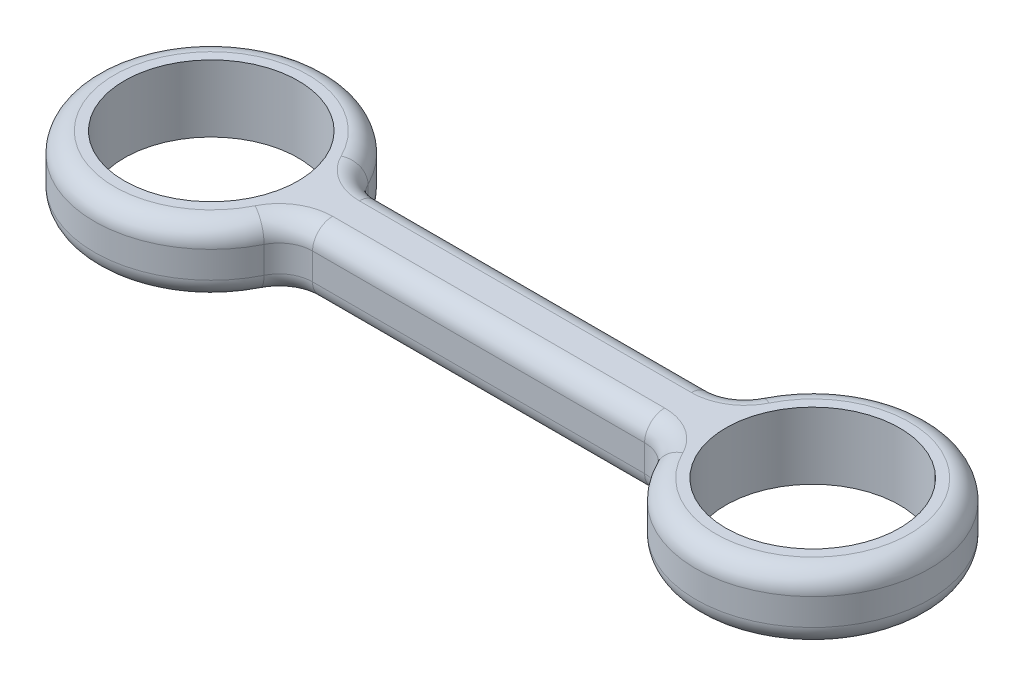
ISO-10303-21;
HEADER;
FILE_DESCRIPTION(('STEP AP214'),'2;1');
FILE_NAME('part.step','',(''),(''),'','','');
FILE_SCHEMA(('AUTOMOTIVE_DESIGN { 1 0 10303 214 1 1 1 1 }'));
ENDSEC;
DATA;
#1=APPLICATION_CONTEXT('core data for automotive mechanical design processes');
#2=APPLICATION_PROTOCOL_DEFINITION('international standard','automotive_design',2000,#1);
#3=PRODUCT_CONTEXT('',#1,'mechanical');
#4=PRODUCT('Part','Part','',(#3));
#5=PRODUCT_RELATED_PRODUCT_CATEGORY('part','',(#4));
#6=PRODUCT_DEFINITION_FORMATION('','',#4);
#7=PRODUCT_DEFINITION_CONTEXT('part definition',#1,'design');
#8=PRODUCT_DEFINITION('design','',#6,#7);
#9=PRODUCT_DEFINITION_SHAPE('','',#8);
#10=(LENGTH_UNIT() NAMED_UNIT(*) SI_UNIT(.MILLI.,.METRE.));
#11=(NAMED_UNIT(*) PLANE_ANGLE_UNIT() SI_UNIT($,.RADIAN.));
#12=(NAMED_UNIT(*) SI_UNIT($,.STERADIAN.) SOLID_ANGLE_UNIT());
#13=UNCERTAINTY_MEASURE_WITH_UNIT(LENGTH_MEASURE(1.E-05),#10,'distance_accuracy_value','');
#14=(GEOMETRIC_REPRESENTATION_CONTEXT(3) GLOBAL_UNCERTAINTY_ASSIGNED_CONTEXT((#13)) GLOBAL_UNIT_ASSIGNED_CONTEXT((#10,
#11,#12)) REPRESENTATION_CONTEXT('',''));
#15=CARTESIAN_POINT('',(0.,0.,0.));
#16=DIRECTION('',(0.,0.,1.));
#17=DIRECTION('',(1.,0.,0.));
#18=AXIS2_PLACEMENT_3D('',#15,#16,#17);
#19=CARTESIAN_POINT('',(0.,5.,0.));
#20=DIRECTION('',(0.,1.,0.));
#21=DIRECTION('',(0.,0.,1.));
#22=AXIS2_PLACEMENT_3D('',#19,#20,#21);
#23=PLANE('',#22);
#24=CARTESIAN_POINT('',(0.,5.,0.));
#25=DIRECTION('',(0.,1.,0.));
#26=DIRECTION('',(0.,0.,1.));
#27=AXIS2_PLACEMENT_3D('',#24,#25,#26);
#28=CIRCLE('',#27,14.5);
#29=CARTESIAN_POINT('',(12.9891930389254,5.,-6.44444444444444));
#30=VERTEX_POINT('',#29);
#31=CARTESIAN_POINT('',(12.9891930389254,5.,6.44444444444445));
#32=VERTEX_POINT('',#31);
#33=EDGE_CURVE('E63',#30,#32,#28,.T.);
#34=ORIENTED_EDGE('',*,*,#33,.T.);
#35=CARTESIAN_POINT('',(20.1556443707464,5.,10.));
#36=DIRECTION('',(0.,1.,0.));
#37=DIRECTION('',(0.,0.,1.));
#38=AXIS2_PLACEMENT_3D('',#35,#36,#37);
#39=CIRCLE('',#38,8.);
#40=CARTESIAN_POINT('',(20.1556443707464,5.,2.));
#41=VERTEX_POINT('',#40);
#42=EDGE_CURVE('E277',#32,#41,#39,.F.);
#43=ORIENTED_EDGE('',*,*,#42,.T.);
#44=DIRECTION('',(1.,0.,0.));
#45=VECTOR('',#44,1.);
#46=CARTESIAN_POINT('',(69.8443556292536,5.,2.));
#47=LINE('',#46,#45);
#48=CARTESIAN_POINT('',(69.8443556292536,5.,2.));
#49=VERTEX_POINT('',#48);
#50=EDGE_CURVE('E258',#41,#49,#47,.T.);
#51=ORIENTED_EDGE('',*,*,#50,.T.);
#52=CARTESIAN_POINT('',(69.8443556292536,5.,10.));
#53=DIRECTION('',(0.,1.,0.));
#54=DIRECTION('',(0.,0.,1.));
#55=AXIS2_PLACEMENT_3D('',#52,#53,#54);
#56=CIRCLE('',#55,8.);
#57=CARTESIAN_POINT('',(77.0108069610746,5.,6.44444444444444));
#58=VERTEX_POINT('',#57);
#59=EDGE_CURVE('E261',#49,#58,#56,.F.);
#60=ORIENTED_EDGE('',*,*,#59,.T.);
#61=CARTESIAN_POINT('',(90.,5.,0.));
#62=DIRECTION('',(0.,1.,0.));
#63=DIRECTION('',(0.,0.,1.));
#64=AXIS2_PLACEMENT_3D('',#61,#62,#63);
#65=CIRCLE('',#64,14.5);
#66=CARTESIAN_POINT('',(77.0108069610746,5.,-6.44444444444445));
#67=VERTEX_POINT('',#66);
#68=EDGE_CURVE('E264',#58,#67,#65,.T.);
#69=ORIENTED_EDGE('',*,*,#68,.T.);
#70=CARTESIAN_POINT('',(69.8443556292536,5.,-10.));
#71=DIRECTION('',(0.,1.,0.));
#72=DIRECTION('',(0.,0.,1.));
#73=AXIS2_PLACEMENT_3D('',#70,#71,#72);
#74=CIRCLE('',#73,8.);
#75=CARTESIAN_POINT('',(69.8443556292536,5.,-2.));
#76=VERTEX_POINT('',#75);
#77=EDGE_CURVE('E267',#67,#76,#74,.F.);
#78=ORIENTED_EDGE('',*,*,#77,.T.);
#79=DIRECTION('',(-1.,0.,0.));
#80=VECTOR('',#79,1.);
#81=CARTESIAN_POINT('',(20.1556443707464,5.,-2.));
#82=LINE('',#81,#80);
#83=CARTESIAN_POINT('',(20.1556443707464,5.,-2.));
#84=VERTEX_POINT('',#83);
#85=EDGE_CURVE('E270',#76,#84,#82,.T.);
#86=ORIENTED_EDGE('',*,*,#85,.T.);
#87=CARTESIAN_POINT('',(20.1556443707464,5.,-10.));
#88=DIRECTION('',(0.,1.,0.));
#89=DIRECTION('',(0.,0.,1.));
#90=AXIS2_PLACEMENT_3D('',#87,#88,#89);
#91=CIRCLE('',#90,8.);
#92=EDGE_CURVE('E68',#84,#30,#91,.F.);
#93=ORIENTED_EDGE('',*,*,#92,.T.);
#94=EDGE_LOOP('',(#34,#43,#51,#60,#69,#78,#86,#93));
#95=FACE_BOUND('',#94,.T.);
#96=CARTESIAN_POINT('',(0.,5.,0.));
#97=DIRECTION('',(0.,1.,0.));
#98=DIRECTION('',(0.,0.,1.));
#99=AXIS2_PLACEMENT_3D('',#96,#97,#98);
#100=CIRCLE('',#99,13.);
#101=CARTESIAN_POINT('',(0.,5.,13.));
#102=VERTEX_POINT('',#101);
#103=EDGE_CURVE('E362',#102,#102,#100,.T.);
#104=ORIENTED_EDGE('',*,*,#103,.F.);
#105=EDGE_LOOP('',(#104));
#106=FACE_BOUND('',#105,.T.);
#107=CARTESIAN_POINT('',(90.,5.,0.));
#108=DIRECTION('',(0.,1.,0.));
#109=DIRECTION('',(0.,0.,1.));
#110=AXIS2_PLACEMENT_3D('',#107,#108,#109);
#111=CIRCLE('',#110,13.);
#112=CARTESIAN_POINT('',(90.,5.,13.));
#113=VERTEX_POINT('',#112);
#114=EDGE_CURVE('E738',#113,#113,#111,.T.);
#115=ORIENTED_EDGE('',*,*,#114,.F.);
#116=EDGE_LOOP('',(#115));
#117=FACE_BOUND('',#116,.T.);
#118=ADVANCED_FACE('F45',(#95,#106,#117),#23,.T.);
#119=CARTESIAN_POINT('',(0.,-5.,0.));
#120=DIRECTION('',(0.,1.,0.));
#121=DIRECTION('',(0.,0.,1.));
#122=AXIS2_PLACEMENT_3D('',#119,#120,#121);
#123=PLANE('',#122);
#124=DIRECTION('',(1.,0.,0.));
#125=VECTOR('',#124,1.);
#126=CARTESIAN_POINT('',(0.,-5.,2.));
#127=LINE('',#126,#125);
#128=CARTESIAN_POINT('',(69.8443556292536,-5.,2.));
#129=VERTEX_POINT('',#128);
#130=CARTESIAN_POINT('',(20.1556443707464,-5.,2.));
#131=VERTEX_POINT('',#130);
#132=EDGE_CURVE('E165',#129,#131,#127,.F.);
#133=ORIENTED_EDGE('',*,*,#132,.T.);
#134=CARTESIAN_POINT('',(20.1556443707464,-5.,10.));
#135=DIRECTION('',(0.,1.,0.));
#136=DIRECTION('',(0.,0.,1.));
#137=AXIS2_PLACEMENT_3D('',#134,#135,#136);
#138=CIRCLE('',#137,8.);
#139=CARTESIAN_POINT('',(12.9891930389254,-5.,6.44444444444445));
#140=VERTEX_POINT('',#139);
#141=EDGE_CURVE('E212',#131,#140,#138,.T.);
#142=ORIENTED_EDGE('',*,*,#141,.T.);
#143=CARTESIAN_POINT('',(0.,-5.,0.));
#144=DIRECTION('',(0.,1.,0.));
#145=DIRECTION('',(0.,0.,1.));
#146=AXIS2_PLACEMENT_3D('',#143,#144,#145);
#147=CIRCLE('',#146,14.5);
#148=CARTESIAN_POINT('',(12.9891930389254,-5.,-6.44444444444444));
#149=VERTEX_POINT('',#148);
#150=EDGE_CURVE('E209',#140,#149,#147,.F.);
#151=ORIENTED_EDGE('',*,*,#150,.T.);
#152=CARTESIAN_POINT('',(20.1556443707464,-5.,-10.));
#153=DIRECTION('',(0.,1.,0.));
#154=DIRECTION('',(0.,0.,1.));
#155=AXIS2_PLACEMENT_3D('',#152,#153,#154);
#156=CIRCLE('',#155,8.);
#157=CARTESIAN_POINT('',(20.1556443707464,-5.,-2.));
#158=VERTEX_POINT('',#157);
#159=EDGE_CURVE('E206',#149,#158,#156,.T.);
#160=ORIENTED_EDGE('',*,*,#159,.T.);
#161=DIRECTION('',(-1.,0.,0.));
#162=VECTOR('',#161,1.);
#163=CARTESIAN_POINT('',(0.,-5.,-2.));
#164=LINE('',#163,#162);
#165=CARTESIAN_POINT('',(69.8443556292536,-5.,-2.));
#166=VERTEX_POINT('',#165);
#167=EDGE_CURVE('E203',#158,#166,#164,.F.);
#168=ORIENTED_EDGE('',*,*,#167,.T.);
#169=CARTESIAN_POINT('',(69.8443556292536,-5.,-10.));
#170=DIRECTION('',(0.,1.,0.));
#171=DIRECTION('',(0.,0.,1.));
#172=AXIS2_PLACEMENT_3D('',#169,#170,#171);
#173=CIRCLE('',#172,8.);
#174=CARTESIAN_POINT('',(77.0108069610746,-5.,-6.44444444444445));
#175=VERTEX_POINT('',#174);
#176=EDGE_CURVE('E200',#166,#175,#173,.T.);
#177=ORIENTED_EDGE('',*,*,#176,.T.);
#178=CARTESIAN_POINT('',(90.,-5.,0.));
#179=DIRECTION('',(0.,1.,0.));
#180=DIRECTION('',(0.,0.,1.));
#181=AXIS2_PLACEMENT_3D('',#178,#179,#180);
#182=CIRCLE('',#181,14.5);
#183=CARTESIAN_POINT('',(77.0108069610746,-5.,6.44444444444444));
#184=VERTEX_POINT('',#183);
#185=EDGE_CURVE('E168',#175,#184,#182,.F.);
#186=ORIENTED_EDGE('',*,*,#185,.T.);
#187=CARTESIAN_POINT('',(69.8443556292536,-5.,10.));
#188=DIRECTION('',(0.,1.,0.));
#189=DIRECTION('',(0.,0.,1.));
#190=AXIS2_PLACEMENT_3D('',#187,#188,#189);
#191=CIRCLE('',#190,8.);
#192=EDGE_CURVE('E159',#184,#129,#191,.T.);
#193=ORIENTED_EDGE('',*,*,#192,.T.);
#194=EDGE_LOOP('',(#133,#142,#151,#160,#168,#177,#186,#193));
#195=FACE_BOUND('',#194,.T.);
#196=CARTESIAN_POINT('',(0.,-5.,0.));
#197=DIRECTION('',(0.,1.,0.));
#198=DIRECTION('',(0.,0.,1.));
#199=AXIS2_PLACEMENT_3D('',#196,#197,#198);
#200=CIRCLE('',#199,13.);
#201=CARTESIAN_POINT('',(0.,-5.,13.));
#202=VERTEX_POINT('',#201);
#203=EDGE_CURVE('E370',#202,#202,#200,.T.);
#204=ORIENTED_EDGE('',*,*,#203,.T.);
#205=EDGE_LOOP('',(#204));
#206=FACE_BOUND('',#205,.T.);
#207=CARTESIAN_POINT('',(90.,-5.,0.));
#208=DIRECTION('',(0.,1.,0.));
#209=DIRECTION('',(0.,0.,1.));
#210=AXIS2_PLACEMENT_3D('',#207,#208,#209);
#211=CIRCLE('',#210,13.);
#212=CARTESIAN_POINT('',(90.,-5.,13.));
#213=VERTEX_POINT('',#212);
#214=EDGE_CURVE('E304',#213,#213,#211,.T.);
#215=ORIENTED_EDGE('',*,*,#214,.T.);
#216=EDGE_LOOP('',(#215));
#217=FACE_BOUND('',#216,.T.);
#218=ADVANCED_FACE('F161',(#195,#206,#217),#123,.F.);
#219=CARTESIAN_POINT('',(0.,5.,0.));
#220=DIRECTION('',(0.,-1.,0.));
#221=DIRECTION('',(0.,0.,-1.));
#222=AXIS2_PLACEMENT_3D('',#219,#220,#221);
#223=CYLINDRICAL_SURFACE('',#222,17.5);
#224=DIRECTION('',(0.,-1.,0.));
#225=VECTOR('',#224,1.);
#226=CARTESIAN_POINT('',(15.6766122883583,5.,-7.77777777777778));
#227=LINE('',#226,#225);
#228=CARTESIAN_POINT('',(15.6766122883583,2.,-7.77777777777778));
#229=VERTEX_POINT('',#228);
#230=CARTESIAN_POINT('',(15.6766122883583,-2.,-7.77777777777778));
#231=VERTEX_POINT('',#230);
#232=EDGE_CURVE('E189',#229,#231,#227,.T.);
#233=ORIENTED_EDGE('',*,*,#232,.T.);
#234=CARTESIAN_POINT('',(0.,-2.,0.));
#235=DIRECTION('',(0.,1.,0.));
#236=DIRECTION('',(0.,0.,1.));
#237=AXIS2_PLACEMENT_3D('',#234,#235,#236);
#238=CIRCLE('',#237,17.5);
#239=CARTESIAN_POINT('',(15.6766122883583,-2.,7.77777777777778));
#240=VERTEX_POINT('',#239);
#241=EDGE_CURVE('E226',#231,#240,#238,.T.);
#242=ORIENTED_EDGE('',*,*,#241,.T.);
#243=DIRECTION('',(0.,-1.,0.));
#244=VECTOR('',#243,1.);
#245=CARTESIAN_POINT('',(15.6766122883583,5.,7.77777777777778));
#246=LINE('',#245,#244);
#247=CARTESIAN_POINT('',(15.6766122883583,2.,7.77777777777778));
#248=VERTEX_POINT('',#247);
#249=EDGE_CURVE('E194',#240,#248,#246,.F.);
#250=ORIENTED_EDGE('',*,*,#249,.T.);
#251=CARTESIAN_POINT('',(0.,2.,0.));
#252=DIRECTION('',(0.,1.,0.));
#253=DIRECTION('',(0.,0.,1.));
#254=AXIS2_PLACEMENT_3D('',#251,#252,#253);
#255=CIRCLE('',#254,17.5);
#256=EDGE_CURVE('E223',#248,#229,#255,.F.);
#257=ORIENTED_EDGE('',*,*,#256,.T.);
#258=EDGE_LOOP('',(#233,#242,#250,#257));
#259=FACE_BOUND('',#258,.T.);
#260=ADVANCED_FACE('F391',(#259),#223,.T.);
#261=CARTESIAN_POINT('',(16.7705098312484,5.,5.));
#262=DIRECTION('',(0.,0.,-1.));
#263=DIRECTION('',(-1.,0.,0.));
#264=AXIS2_PLACEMENT_3D('',#261,#262,#263);
#265=PLANE('',#264);
#266=DIRECTION('',(0.,1.,0.));
#267=VECTOR('',#266,1.);
#268=CARTESIAN_POINT('',(20.1556443707464,-5.,5.));
#269=LINE('',#268,#267);
#270=CARTESIAN_POINT('',(20.1556443707464,2.,5.));
#271=VERTEX_POINT('',#270);
#272=CARTESIAN_POINT('',(20.1556443707464,-2.,5.));
#273=VERTEX_POINT('',#272);
#274=EDGE_CURVE('E367',#271,#273,#269,.F.);
#275=ORIENTED_EDGE('',*,*,#274,.T.);
#276=DIRECTION('',(1.,0.,0.));
#277=VECTOR('',#276,1.);
#278=CARTESIAN_POINT('',(16.7705098312484,-2.,5.));
#279=LINE('',#278,#277);
#280=CARTESIAN_POINT('',(69.8443556292536,-2.,5.));
#281=VERTEX_POINT('',#280);
#282=EDGE_CURVE('E11',#273,#281,#279,.T.);
#283=ORIENTED_EDGE('',*,*,#282,.T.);
#284=DIRECTION('',(0.,1.,0.));
#285=VECTOR('',#284,1.);
#286=CARTESIAN_POINT('',(69.8443556292536,5.,5.));
#287=LINE('',#286,#285);
#288=CARTESIAN_POINT('',(69.8443556292536,2.,5.));
#289=VERTEX_POINT('',#288);
#290=EDGE_CURVE('E377',#281,#289,#287,.T.);
#291=ORIENTED_EDGE('',*,*,#290,.T.);
#292=DIRECTION('',(1.,0.,0.));
#293=VECTOR('',#292,1.);
#294=CARTESIAN_POINT('',(20.1556443707464,2.,5.));
#295=LINE('',#294,#293);
#296=EDGE_CURVE('E55',#289,#271,#295,.F.);
#297=ORIENTED_EDGE('',*,*,#296,.T.);
#298=EDGE_LOOP('',(#275,#283,#291,#297));
#299=FACE_BOUND('',#298,.T.);
#300=ADVANCED_FACE('F448',(#299),#265,.F.);
#301=CARTESIAN_POINT('',(90.,5.,0.));
#302=DIRECTION('',(0.,-1.,0.));
#303=DIRECTION('',(0.,0.,-1.));
#304=AXIS2_PLACEMENT_3D('',#301,#302,#303);
#305=CYLINDRICAL_SURFACE('',#304,17.5);
#306=DIRECTION('',(0.,-1.,0.));
#307=VECTOR('',#306,1.);
#308=CARTESIAN_POINT('',(74.3233877116417,5.,7.77777777777778));
#309=LINE('',#308,#307);
#310=CARTESIAN_POINT('',(74.3233877116417,2.,7.77777777777778));
#311=VERTEX_POINT('',#310);
#312=CARTESIAN_POINT('',(74.3233877116417,-2.,7.77777777777778));
#313=VERTEX_POINT('',#312);
#314=EDGE_CURVE('E361',#311,#313,#309,.T.);
#315=ORIENTED_EDGE('',*,*,#314,.T.);
#316=CARTESIAN_POINT('',(90.,-2.,0.));
#317=DIRECTION('',(0.,1.,0.));
#318=DIRECTION('',(0.,0.,1.));
#319=AXIS2_PLACEMENT_3D('',#316,#317,#318);
#320=CIRCLE('',#319,17.5);
#321=CARTESIAN_POINT('',(74.3233877116417,-2.,-7.77777777777778));
#322=VERTEX_POINT('',#321);
#323=EDGE_CURVE('E250',#313,#322,#320,.T.);
#324=ORIENTED_EDGE('',*,*,#323,.T.);
#325=DIRECTION('',(0.,-1.,0.));
#326=VECTOR('',#325,1.);
#327=CARTESIAN_POINT('',(74.3233877116417,5.,-7.77777777777778));
#328=LINE('',#327,#326);
#329=CARTESIAN_POINT('',(74.3233877116417,2.,-7.77777777777778));
#330=VERTEX_POINT('',#329);
#331=EDGE_CURVE('E351',#322,#330,#328,.F.);
#332=ORIENTED_EDGE('',*,*,#331,.T.);
#333=CARTESIAN_POINT('',(90.,2.,0.));
#334=DIRECTION('',(0.,1.,0.));
#335=DIRECTION('',(0.,0.,1.));
#336=AXIS2_PLACEMENT_3D('',#333,#334,#335);
#337=CIRCLE('',#336,17.5);
#338=EDGE_CURVE('E247',#330,#311,#337,.F.);
#339=ORIENTED_EDGE('',*,*,#338,.T.);
#340=EDGE_LOOP('',(#315,#324,#332,#339));
#341=FACE_BOUND('',#340,.T.);
#342=ADVANCED_FACE('F357',(#341),#305,.T.);
#343=CARTESIAN_POINT('',(16.7705098312484,5.,-5.));
#344=DIRECTION('',(0.,0.,1.));
#345=DIRECTION('',(1.,0.,0.));
#346=AXIS2_PLACEMENT_3D('',#343,#344,#345);
#347=PLANE('',#346);
#348=DIRECTION('',(0.,1.,0.));
#349=VECTOR('',#348,1.);
#350=CARTESIAN_POINT('',(69.8443556292536,-5.,-5.));
#351=LINE('',#350,#349);
#352=CARTESIAN_POINT('',(69.8443556292536,2.,-5.));
#353=VERTEX_POINT('',#352);
#354=CARTESIAN_POINT('',(69.8443556292536,-2.,-5.));
#355=VERTEX_POINT('',#354);
#356=EDGE_CURVE('E354',#353,#355,#351,.F.);
#357=ORIENTED_EDGE('',*,*,#356,.T.);
#358=DIRECTION('',(-1.,0.,0.));
#359=VECTOR('',#358,1.);
#360=CARTESIAN_POINT('',(16.7705098312484,-2.,-5.));
#361=LINE('',#360,#359);
#362=CARTESIAN_POINT('',(20.1556443707464,-2.,-5.));
#363=VERTEX_POINT('',#362);
#364=EDGE_CURVE('E238',#355,#363,#361,.T.);
#365=ORIENTED_EDGE('',*,*,#364,.T.);
#366=DIRECTION('',(0.,1.,0.));
#367=VECTOR('',#366,1.);
#368=CARTESIAN_POINT('',(20.1556443707464,5.,-5.));
#369=LINE('',#368,#367);
#370=CARTESIAN_POINT('',(20.1556443707464,2.,-5.));
#371=VERTEX_POINT('',#370);
#372=EDGE_CURVE('E381',#363,#371,#369,.T.);
#373=ORIENTED_EDGE('',*,*,#372,.T.);
#374=DIRECTION('',(-1.,0.,0.));
#375=VECTOR('',#374,1.);
#376=CARTESIAN_POINT('',(69.8443556292536,2.,-5.));
#377=LINE('',#376,#375);
#378=EDGE_CURVE('E235',#371,#353,#377,.F.);
#379=ORIENTED_EDGE('',*,*,#378,.T.);
#380=EDGE_LOOP('',(#357,#365,#373,#379));
#381=FACE_BOUND('',#380,.T.);
#382=ADVANCED_FACE('F442',(#381),#347,.F.);
#383=CARTESIAN_POINT('',(0.,5.,0.));
#384=DIRECTION('',(0.,-1.,0.));
#385=DIRECTION('',(0.,0.,-1.));
#386=AXIS2_PLACEMENT_3D('',#383,#384,#385);
#387=CYLINDRICAL_SURFACE('',#386,13.);
#388=ORIENTED_EDGE('',*,*,#103,.T.);
#389=EDGE_LOOP('',(#388));
#390=FACE_BOUND('',#389,.T.);
#391=ORIENTED_EDGE('',*,*,#203,.F.);
#392=EDGE_LOOP('',(#391));
#393=FACE_BOUND('',#392,.T.);
#394=ADVANCED_FACE('F439',(#390,#393),#387,.F.);
#395=CARTESIAN_POINT('',(90.,5.,0.));
#396=DIRECTION('',(0.,-1.,0.));
#397=DIRECTION('',(0.,0.,-1.));
#398=AXIS2_PLACEMENT_3D('',#395,#396,#397);
#399=CYLINDRICAL_SURFACE('',#398,13.);
#400=ORIENTED_EDGE('',*,*,#114,.T.);
#401=EDGE_LOOP('',(#400));
#402=FACE_BOUND('',#401,.T.);
#403=ORIENTED_EDGE('',*,*,#214,.F.);
#404=EDGE_LOOP('',(#403));
#405=FACE_BOUND('',#404,.T.);
#406=ADVANCED_FACE('F457',(#402,#405),#399,.F.);
#407=CARTESIAN_POINT('',(69.8443556292536,5.,10.));
#408=DIRECTION('',(0.,-1.,0.));
#409=DIRECTION('',(0.,0.,-1.));
#410=AXIS2_PLACEMENT_3D('',#407,#408,#409);
#411=CYLINDRICAL_SURFACE('',#410,5.);
#412=ORIENTED_EDGE('',*,*,#290,.F.);
#413=CARTESIAN_POINT('',(69.8443556292536,-2.,10.));
#414=DIRECTION('',(0.,1.,0.));
#415=DIRECTION('',(0.,0.,1.));
#416=AXIS2_PLACEMENT_3D('',#413,#414,#415);
#417=CIRCLE('',#416,5.);
#418=EDGE_CURVE('E178',#281,#313,#417,.F.);
#419=ORIENTED_EDGE('',*,*,#418,.T.);
#420=ORIENTED_EDGE('',*,*,#314,.F.);
#421=CARTESIAN_POINT('',(69.8443556292536,2.,10.));
#422=DIRECTION('',(0.,1.,0.));
#423=DIRECTION('',(0.,0.,1.));
#424=AXIS2_PLACEMENT_3D('',#421,#422,#423);
#425=CIRCLE('',#424,5.);
#426=EDGE_CURVE('E253',#311,#289,#425,.T.);
#427=ORIENTED_EDGE('',*,*,#426,.T.);
#428=EDGE_LOOP('',(#412,#419,#420,#427));
#429=FACE_BOUND('',#428,.T.);
#430=ADVANCED_FACE('F454',(#429),#411,.F.);
#431=CARTESIAN_POINT('',(69.8443556292536,5.,-10.));
#432=DIRECTION('',(0.,-1.,0.));
#433=DIRECTION('',(0.,0.,-1.));
#434=AXIS2_PLACEMENT_3D('',#431,#432,#433);
#435=CYLINDRICAL_SURFACE('',#434,5.);
#436=ORIENTED_EDGE('',*,*,#331,.F.);
#437=CARTESIAN_POINT('',(69.8443556292536,-2.,-10.));
#438=DIRECTION('',(0.,1.,0.));
#439=DIRECTION('',(0.,0.,1.));
#440=AXIS2_PLACEMENT_3D('',#437,#438,#439);
#441=CIRCLE('',#440,5.);
#442=EDGE_CURVE('E244',#322,#355,#441,.F.);
#443=ORIENTED_EDGE('',*,*,#442,.T.);
#444=ORIENTED_EDGE('',*,*,#356,.F.);
#445=CARTESIAN_POINT('',(69.8443556292536,2.,-10.));
#446=DIRECTION('',(0.,1.,0.));
#447=DIRECTION('',(0.,0.,1.));
#448=AXIS2_PLACEMENT_3D('',#445,#446,#447);
#449=CIRCLE('',#448,5.);
#450=EDGE_CURVE('E241',#353,#330,#449,.T.);
#451=ORIENTED_EDGE('',*,*,#450,.T.);
#452=EDGE_LOOP('',(#436,#443,#444,#451));
#453=FACE_BOUND('',#452,.T.);
#454=ADVANCED_FACE('F350',(#453),#435,.F.);
#455=CARTESIAN_POINT('',(20.1556443707464,5.,-10.));
#456=DIRECTION('',(0.,-1.,0.));
#457=DIRECTION('',(0.,0.,-1.));
#458=AXIS2_PLACEMENT_3D('',#455,#456,#457);
#459=CYLINDRICAL_SURFACE('',#458,5.);
#460=ORIENTED_EDGE('',*,*,#372,.F.);
#461=CARTESIAN_POINT('',(20.1556443707464,-2.,-10.));
#462=DIRECTION('',(0.,1.,0.));
#463=DIRECTION('',(0.,0.,1.));
#464=AXIS2_PLACEMENT_3D('',#461,#462,#463);
#465=CIRCLE('',#464,5.);
#466=EDGE_CURVE('E232',#363,#231,#465,.F.);
#467=ORIENTED_EDGE('',*,*,#466,.T.);
#468=ORIENTED_EDGE('',*,*,#232,.F.);
#469=CARTESIAN_POINT('',(20.1556443707464,2.,-10.));
#470=DIRECTION('',(0.,1.,0.));
#471=DIRECTION('',(0.,0.,1.));
#472=AXIS2_PLACEMENT_3D('',#469,#470,#471);
#473=CIRCLE('',#472,5.);
#474=EDGE_CURVE('E229',#229,#371,#473,.T.);
#475=ORIENTED_EDGE('',*,*,#474,.T.);
#476=EDGE_LOOP('',(#460,#467,#468,#475));
#477=FACE_BOUND('',#476,.T.);
#478=ADVANCED_FACE('F461',(#477),#459,.F.);
#479=CARTESIAN_POINT('',(20.1556443707464,5.,10.));
#480=DIRECTION('',(0.,-1.,0.));
#481=DIRECTION('',(0.,0.,-1.));
#482=AXIS2_PLACEMENT_3D('',#479,#480,#481);
#483=CYLINDRICAL_SURFACE('',#482,5.);
#484=ORIENTED_EDGE('',*,*,#249,.F.);
#485=CARTESIAN_POINT('',(20.1556443707464,-2.,10.));
#486=DIRECTION('',(0.,1.,0.));
#487=DIRECTION('',(0.,0.,1.));
#488=AXIS2_PLACEMENT_3D('',#485,#486,#487);
#489=CIRCLE('',#488,5.);
#490=EDGE_CURVE('E219',#240,#273,#489,.F.);
#491=ORIENTED_EDGE('',*,*,#490,.T.);
#492=ORIENTED_EDGE('',*,*,#274,.F.);
#493=CARTESIAN_POINT('',(20.1556443707464,2.,10.));
#494=DIRECTION('',(0.,1.,0.));
#495=DIRECTION('',(0.,0.,1.));
#496=AXIS2_PLACEMENT_3D('',#493,#494,#495);
#497=CIRCLE('',#496,5.);
#498=EDGE_CURVE('E215',#271,#248,#497,.T.);
#499=ORIENTED_EDGE('',*,*,#498,.T.);
#500=EDGE_LOOP('',(#484,#491,#492,#499));
#501=FACE_BOUND('',#500,.T.);
#502=ADVANCED_FACE('F397',(#501),#483,.F.);
#503=CARTESIAN_POINT('',(69.8443556292536,-2.,-10.));
#504=DIRECTION('',(0.,1.,0.));
#505=DIRECTION('',(0.,0.,1.));
#506=AXIS2_PLACEMENT_3D('',#503,#504,#505);
#507=TOROIDAL_SURFACE('',#506,8.,3.);
#508=CARTESIAN_POINT('',(69.8443556292536,-2.,-2.));
#509=DIRECTION('',(-1.,0.,0.));
#510=DIRECTION('',(0.,0.,1.));
#511=AXIS2_PLACEMENT_3D('',#508,#509,#510);
#512=CIRCLE('',#511,3.);
#513=EDGE_CURVE('E296',#355,#166,#512,.T.);
#514=ORIENTED_EDGE('',*,*,#513,.F.);
#515=ORIENTED_EDGE('',*,*,#442,.F.);
#516=CARTESIAN_POINT('',(77.0108069610746,-2.,-6.44444444444445));
#517=DIRECTION('',(0.444444444444445,0.,-0.895806416477616));
#518=DIRECTION('',(-0.895806416477616,0.,-0.444444444444445));
#519=AXIS2_PLACEMENT_3D('',#516,#517,#518);
#520=CIRCLE('',#519,3.);
#521=EDGE_CURVE('E300',#175,#322,#520,.T.);
#522=ORIENTED_EDGE('',*,*,#521,.F.);
#523=ORIENTED_EDGE('',*,*,#176,.F.);
#524=EDGE_LOOP('',(#514,#515,#522,#523));
#525=FACE_BOUND('',#524,.T.);
#526=ADVANCED_FACE('F420',(#525),#507,.T.);
#527=CARTESIAN_POINT('',(90.,-2.,0.));
#528=DIRECTION('',(0.,1.,0.));
#529=DIRECTION('',(0.,0.,1.));
#530=AXIS2_PLACEMENT_3D('',#527,#528,#529);
#531=TOROIDAL_SURFACE('',#530,14.5,3.);
#532=ORIENTED_EDGE('',*,*,#521,.T.);
#533=ORIENTED_EDGE('',*,*,#323,.F.);
#534=CARTESIAN_POINT('',(77.0108069610746,-2.,6.44444444444444));
#535=DIRECTION('',(-0.444444444444445,0.,-0.895806416477616));
#536=DIRECTION('',(-0.895806416477616,0.,0.444444444444445));
#537=AXIS2_PLACEMENT_3D('',#534,#535,#536);
#538=CIRCLE('',#537,3.);
#539=EDGE_CURVE('E293',#184,#313,#538,.T.);
#540=ORIENTED_EDGE('',*,*,#539,.F.);
#541=ORIENTED_EDGE('',*,*,#185,.F.);
#542=EDGE_LOOP('',(#532,#533,#540,#541));
#543=FACE_BOUND('',#542,.T.);
#544=ADVANCED_FACE('F422',(#543),#531,.T.);
#545=CARTESIAN_POINT('',(16.7705098312484,-2.,-2.));
#546=DIRECTION('',(-1.,0.,0.));
#547=DIRECTION('',(0.,0.,1.));
#548=AXIS2_PLACEMENT_3D('',#545,#546,#547);
#549=CYLINDRICAL_SURFACE('',#548,3.);
#550=ORIENTED_EDGE('',*,*,#513,.T.);
#551=ORIENTED_EDGE('',*,*,#167,.F.);
#552=CARTESIAN_POINT('',(20.1556443707464,-2.,-2.));
#553=DIRECTION('',(-1.,0.,0.));
#554=DIRECTION('',(0.,0.,1.));
#555=AXIS2_PLACEMENT_3D('',#552,#553,#554);
#556=CIRCLE('',#555,3.);
#557=EDGE_CURVE('E182',#363,#158,#556,.T.);
#558=ORIENTED_EDGE('',*,*,#557,.F.);
#559=ORIENTED_EDGE('',*,*,#364,.F.);
#560=EDGE_LOOP('',(#550,#551,#558,#559));
#561=FACE_BOUND('',#560,.T.);
#562=ADVANCED_FACE('F415',(#561),#549,.T.);
#563=CARTESIAN_POINT('',(69.8443556292536,-2.,10.));
#564=DIRECTION('',(0.,1.,0.));
#565=DIRECTION('',(0.,0.,1.));
#566=AXIS2_PLACEMENT_3D('',#563,#564,#565);
#567=TOROIDAL_SURFACE('',#566,8.,3.);
#568=ORIENTED_EDGE('',*,*,#539,.T.);
#569=ORIENTED_EDGE('',*,*,#418,.F.);
#570=CARTESIAN_POINT('',(69.8443556292536,-2.,2.));
#571=DIRECTION('',(-1.,0.,0.));
#572=DIRECTION('',(0.,0.,1.));
#573=AXIS2_PLACEMENT_3D('',#570,#571,#572);
#574=CIRCLE('',#573,3.);
#575=EDGE_CURVE('E176',#129,#281,#574,.T.);
#576=ORIENTED_EDGE('',*,*,#575,.F.);
#577=ORIENTED_EDGE('',*,*,#192,.F.);
#578=EDGE_LOOP('',(#568,#569,#576,#577));
#579=FACE_BOUND('',#578,.T.);
#580=ADVANCED_FACE('F177',(#579),#567,.T.);
#581=CARTESIAN_POINT('',(20.1556443707464,-2.,-10.));
#582=DIRECTION('',(0.,1.,0.));
#583=DIRECTION('',(0.,0.,1.));
#584=AXIS2_PLACEMENT_3D('',#581,#582,#583);
#585=TOROIDAL_SURFACE('',#584,8.,3.);
#586=ORIENTED_EDGE('',*,*,#557,.T.);
#587=ORIENTED_EDGE('',*,*,#159,.F.);
#588=CARTESIAN_POINT('',(12.9891930389254,-2.,-6.44444444444445));
#589=DIRECTION('',(-0.444444444444444,0.,-0.895806416477617));
#590=DIRECTION('',(-0.895806416477617,0.,0.444444444444444));
#591=AXIS2_PLACEMENT_3D('',#588,#589,#590);
#592=CIRCLE('',#591,3.);
#593=EDGE_CURVE('E183',#231,#149,#592,.T.);
#594=ORIENTED_EDGE('',*,*,#593,.F.);
#595=ORIENTED_EDGE('',*,*,#466,.F.);
#596=EDGE_LOOP('',(#586,#587,#594,#595));
#597=FACE_BOUND('',#596,.T.);
#598=ADVANCED_FACE('F410',(#597),#585,.T.);
#599=CARTESIAN_POINT('',(16.7705098312484,-2.,2.));
#600=DIRECTION('',(1.,0.,0.));
#601=DIRECTION('',(0.,0.,-1.));
#602=AXIS2_PLACEMENT_3D('',#599,#600,#601);
#603=CYLINDRICAL_SURFACE('',#602,3.);
#604=ORIENTED_EDGE('',*,*,#575,.T.);
#605=ORIENTED_EDGE('',*,*,#282,.F.);
#606=CARTESIAN_POINT('',(20.1556443707464,-2.,2.));
#607=DIRECTION('',(-1.,0.,0.));
#608=DIRECTION('',(0.,0.,1.));
#609=AXIS2_PLACEMENT_3D('',#606,#607,#608);
#610=CIRCLE('',#609,3.);
#611=EDGE_CURVE('E186',#131,#273,#610,.T.);
#612=ORIENTED_EDGE('',*,*,#611,.F.);
#613=ORIENTED_EDGE('',*,*,#132,.F.);
#614=EDGE_LOOP('',(#604,#605,#612,#613));
#615=FACE_BOUND('',#614,.T.);
#616=ADVANCED_FACE('F185',(#615),#603,.T.);
#617=CARTESIAN_POINT('',(0.,-2.,0.));
#618=DIRECTION('',(0.,1.,0.));
#619=DIRECTION('',(0.,0.,1.));
#620=AXIS2_PLACEMENT_3D('',#617,#618,#619);
#621=TOROIDAL_SURFACE('',#620,14.5,3.);
#622=ORIENTED_EDGE('',*,*,#593,.T.);
#623=ORIENTED_EDGE('',*,*,#150,.F.);
#624=CARTESIAN_POINT('',(12.9891930389254,-2.,6.44444444444445));
#625=DIRECTION('',(0.444444444444445,0.,-0.895806416477617));
#626=DIRECTION('',(-0.895806416477617,0.,-0.444444444444445));
#627=AXIS2_PLACEMENT_3D('',#624,#625,#626);
#628=CIRCLE('',#627,3.);
#629=EDGE_CURVE('E282',#240,#140,#628,.T.);
#630=ORIENTED_EDGE('',*,*,#629,.F.);
#631=ORIENTED_EDGE('',*,*,#241,.F.);
#632=EDGE_LOOP('',(#622,#623,#630,#631));
#633=FACE_BOUND('',#632,.T.);
#634=ADVANCED_FACE('F405',(#633),#621,.T.);
#635=CARTESIAN_POINT('',(20.1556443707464,-2.,10.));
#636=DIRECTION('',(0.,1.,0.));
#637=DIRECTION('',(0.,0.,1.));
#638=AXIS2_PLACEMENT_3D('',#635,#636,#637);
#639=TOROIDAL_SURFACE('',#638,8.,3.);
#640=ORIENTED_EDGE('',*,*,#611,.T.);
#641=ORIENTED_EDGE('',*,*,#490,.F.);
#642=ORIENTED_EDGE('',*,*,#629,.T.);
#643=ORIENTED_EDGE('',*,*,#141,.F.);
#644=EDGE_LOOP('',(#640,#641,#642,#643));
#645=FACE_BOUND('',#644,.T.);
#646=ADVANCED_FACE('F402',(#645),#639,.T.);
#647=CARTESIAN_POINT('',(69.8443556292536,2.,-10.));
#648=DIRECTION('',(0.,1.,0.));
#649=DIRECTION('',(0.,0.,1.));
#650=AXIS2_PLACEMENT_3D('',#647,#648,#649);
#651=TOROIDAL_SURFACE('',#650,8.,3.);
#652=CARTESIAN_POINT('',(77.0108069610746,2.,-6.44444444444445));
#653=DIRECTION('',(0.444444444444444,0.,-0.895806416477617));
#654=DIRECTION('',(-0.895806416477617,0.,-0.444444444444444));
#655=AXIS2_PLACEMENT_3D('',#652,#653,#654);
#656=CIRCLE('',#655,3.);
#657=EDGE_CURVE('E326',#330,#67,#656,.T.);
#658=ORIENTED_EDGE('',*,*,#657,.F.);
#659=ORIENTED_EDGE('',*,*,#450,.F.);
#660=CARTESIAN_POINT('',(69.8443556292536,2.,-2.));
#661=DIRECTION('',(-1.,0.,0.));
#662=DIRECTION('',(0.,0.,1.));
#663=AXIS2_PLACEMENT_3D('',#660,#661,#662);
#664=CIRCLE('',#663,3.);
#665=EDGE_CURVE('E49',#76,#353,#664,.T.);
#666=ORIENTED_EDGE('',*,*,#665,.F.);
#667=ORIENTED_EDGE('',*,*,#77,.F.);
#668=EDGE_LOOP('',(#658,#659,#666,#667));
#669=FACE_BOUND('',#668,.T.);
#670=ADVANCED_FACE('F47',(#669),#651,.T.);
#671=CARTESIAN_POINT('',(0.,2.,-2.));
#672=DIRECTION('',(1.,0.,0.));
#673=DIRECTION('',(0.,0.,-1.));
#674=AXIS2_PLACEMENT_3D('',#671,#672,#673);
#675=CYLINDRICAL_SURFACE('',#674,3.);
#676=ORIENTED_EDGE('',*,*,#665,.T.);
#677=ORIENTED_EDGE('',*,*,#378,.F.);
#678=CARTESIAN_POINT('',(20.1556443707464,2.,-2.));
#679=DIRECTION('',(-1.,0.,0.));
#680=DIRECTION('',(0.,0.,1.));
#681=AXIS2_PLACEMENT_3D('',#678,#679,#680);
#682=CIRCLE('',#681,3.);
#683=EDGE_CURVE('E323',#84,#371,#682,.T.);
#684=ORIENTED_EDGE('',*,*,#683,.F.);
#685=ORIENTED_EDGE('',*,*,#85,.F.);
#686=EDGE_LOOP('',(#676,#677,#684,#685));
#687=FACE_BOUND('',#686,.T.);
#688=ADVANCED_FACE('F341',(#687),#675,.T.);
#689=CARTESIAN_POINT('',(90.,2.,0.));
#690=DIRECTION('',(0.,1.,0.));
#691=DIRECTION('',(0.,0.,1.));
#692=AXIS2_PLACEMENT_3D('',#689,#690,#691);
#693=TOROIDAL_SURFACE('',#692,14.5,3.);
#694=ORIENTED_EDGE('',*,*,#657,.T.);
#695=ORIENTED_EDGE('',*,*,#68,.F.);
#696=CARTESIAN_POINT('',(77.0108069610746,2.,6.44444444444444));
#697=DIRECTION('',(-0.444444444444445,0.,-0.895806416477616));
#698=DIRECTION('',(-0.895806416477616,0.,0.444444444444445));
#699=AXIS2_PLACEMENT_3D('',#696,#697,#698);
#700=CIRCLE('',#699,3.);
#701=EDGE_CURVE('E319',#311,#58,#700,.T.);
#702=ORIENTED_EDGE('',*,*,#701,.F.);
#703=ORIENTED_EDGE('',*,*,#338,.F.);
#704=EDGE_LOOP('',(#694,#695,#702,#703));
#705=FACE_BOUND('',#704,.T.);
#706=ADVANCED_FACE('F507',(#705),#693,.T.);
#707=CARTESIAN_POINT('',(20.1556443707464,2.,-10.));
#708=DIRECTION('',(0.,1.,0.));
#709=DIRECTION('',(0.,0.,1.));
#710=AXIS2_PLACEMENT_3D('',#707,#708,#709);
#711=TOROIDAL_SURFACE('',#710,8.,3.);
#712=ORIENTED_EDGE('',*,*,#683,.T.);
#713=ORIENTED_EDGE('',*,*,#474,.F.);
#714=CARTESIAN_POINT('',(12.9891930389254,2.,-6.44444444444444));
#715=DIRECTION('',(-0.444444444444445,0.,-0.895806416477616));
#716=DIRECTION('',(-0.895806416477616,0.,0.444444444444445));
#717=AXIS2_PLACEMENT_3D('',#714,#715,#716);
#718=CIRCLE('',#717,3.);
#719=EDGE_CURVE('E315',#30,#229,#718,.T.);
#720=ORIENTED_EDGE('',*,*,#719,.F.);
#721=ORIENTED_EDGE('',*,*,#92,.F.);
#722=EDGE_LOOP('',(#712,#713,#720,#721));
#723=FACE_BOUND('',#722,.T.);
#724=ADVANCED_FACE('F513',(#723),#711,.T.);
#725=CARTESIAN_POINT('',(69.8443556292536,2.,10.));
#726=DIRECTION('',(0.,1.,0.));
#727=DIRECTION('',(0.,0.,1.));
#728=AXIS2_PLACEMENT_3D('',#725,#726,#727);
#729=TOROIDAL_SURFACE('',#728,8.,3.);
#730=ORIENTED_EDGE('',*,*,#701,.T.);
#731=ORIENTED_EDGE('',*,*,#59,.F.);
#732=CARTESIAN_POINT('',(69.8443556292536,2.,2.));
#733=DIRECTION('',(-1.,0.,0.));
#734=DIRECTION('',(0.,0.,1.));
#735=AXIS2_PLACEMENT_3D('',#732,#733,#734);
#736=CIRCLE('',#735,3.);
#737=EDGE_CURVE('E311',#289,#49,#736,.T.);
#738=ORIENTED_EDGE('',*,*,#737,.F.);
#739=ORIENTED_EDGE('',*,*,#426,.F.);
#740=EDGE_LOOP('',(#730,#731,#738,#739));
#741=FACE_BOUND('',#740,.T.);
#742=ADVANCED_FACE('F520',(#741),#729,.T.);
#743=CARTESIAN_POINT('',(0.,2.,0.));
#744=DIRECTION('',(0.,1.,0.));
#745=DIRECTION('',(0.,0.,1.));
#746=AXIS2_PLACEMENT_3D('',#743,#744,#745);
#747=TOROIDAL_SURFACE('',#746,14.5,3.);
#748=ORIENTED_EDGE('',*,*,#719,.T.);
#749=ORIENTED_EDGE('',*,*,#256,.F.);
#750=CARTESIAN_POINT('',(12.9891930389254,2.,6.44444444444445));
#751=DIRECTION('',(0.444444444444444,0.,-0.895806416477617));
#752=DIRECTION('',(-0.895806416477617,0.,-0.444444444444444));
#753=AXIS2_PLACEMENT_3D('',#750,#751,#752);
#754=CIRCLE('',#753,3.);
#755=EDGE_CURVE('E308',#32,#248,#754,.T.);
#756=ORIENTED_EDGE('',*,*,#755,.F.);
#757=ORIENTED_EDGE('',*,*,#33,.F.);
#758=EDGE_LOOP('',(#748,#749,#756,#757));
#759=FACE_BOUND('',#758,.T.);
#760=ADVANCED_FACE('F528',(#759),#747,.T.);
#761=CARTESIAN_POINT('',(0.,2.,2.));
#762=DIRECTION('',(-1.,0.,0.));
#763=DIRECTION('',(0.,0.,1.));
#764=AXIS2_PLACEMENT_3D('',#761,#762,#763);
#765=CYLINDRICAL_SURFACE('',#764,3.);
#766=ORIENTED_EDGE('',*,*,#737,.T.);
#767=ORIENTED_EDGE('',*,*,#50,.F.);
#768=CARTESIAN_POINT('',(20.1556443707464,2.,2.));
#769=DIRECTION('',(-1.,0.,0.));
#770=DIRECTION('',(0.,0.,1.));
#771=AXIS2_PLACEMENT_3D('',#768,#769,#770);
#772=CIRCLE('',#771,3.);
#773=EDGE_CURVE('E305',#271,#41,#772,.T.);
#774=ORIENTED_EDGE('',*,*,#773,.F.);
#775=ORIENTED_EDGE('',*,*,#296,.F.);
#776=EDGE_LOOP('',(#766,#767,#774,#775));
#777=FACE_BOUND('',#776,.T.);
#778=ADVANCED_FACE('F536',(#777),#765,.T.);
#779=CARTESIAN_POINT('',(20.1556443707464,2.,10.));
#780=DIRECTION('',(0.,1.,0.));
#781=DIRECTION('',(0.,0.,1.));
#782=AXIS2_PLACEMENT_3D('',#779,#780,#781);
#783=TOROIDAL_SURFACE('',#782,8.,3.);
#784=ORIENTED_EDGE('',*,*,#755,.T.);
#785=ORIENTED_EDGE('',*,*,#498,.F.);
#786=ORIENTED_EDGE('',*,*,#773,.T.);
#787=ORIENTED_EDGE('',*,*,#42,.F.);
#788=EDGE_LOOP('',(#784,#785,#786,#787));
#789=FACE_BOUND('',#788,.T.);
#790=ADVANCED_FACE('F544',(#789),#783,.T.);
#791=CLOSED_SHELL('',(#118,#218,#260,#300,#342,#382,#394,#406,#430,#454,#478,#502,#526,#544,
#562,#580,#598,#616,#634,#646,#670,#688,#706,#724,#742,#760,#778,#790));
#792=MANIFOLD_SOLID_BREP('B2',#791);
#793=ADVANCED_BREP_SHAPE_REPRESENTATION('',(#18,#792),#14);
#794=SHAPE_DEFINITION_REPRESENTATION(#9,#793);
ENDSEC;
END-ISO-10303-21;
